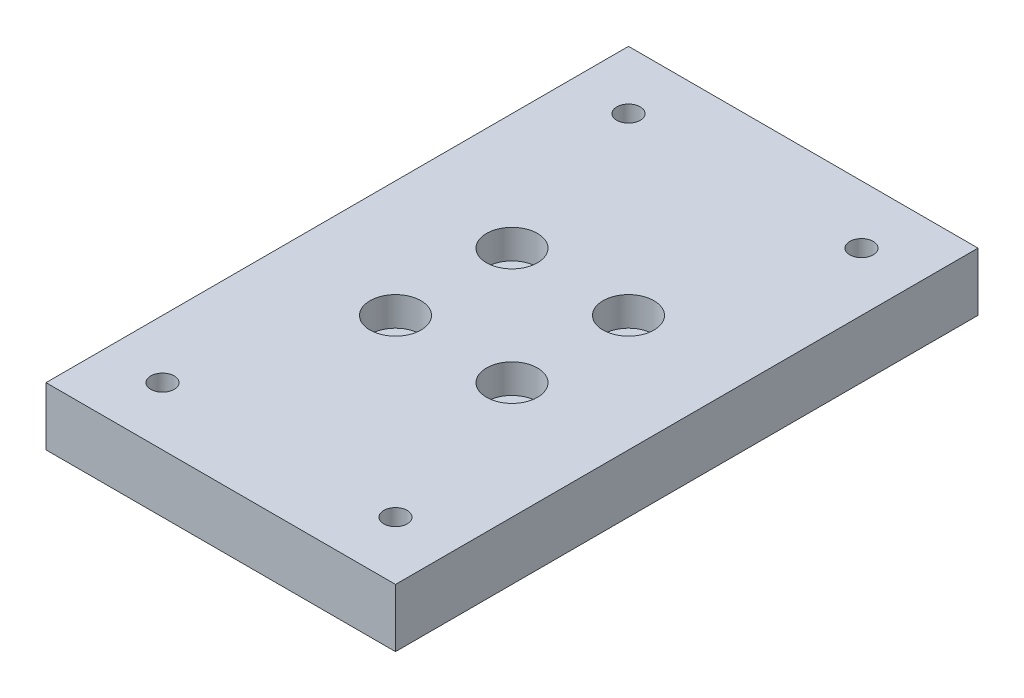
ISO-10303-21;
HEADER;
FILE_DESCRIPTION(('STEP AP214'),'2;1');
FILE_NAME('part.step','',(''),(''),'','','');
FILE_SCHEMA(('AUTOMOTIVE_DESIGN { 1 0 10303 214 1 1 1 1 }'));
ENDSEC;
DATA;
#1=APPLICATION_CONTEXT('core data for automotive mechanical design processes');
#2=APPLICATION_PROTOCOL_DEFINITION('international standard','automotive_design',2000,#1);
#3=PRODUCT_CONTEXT('',#1,'mechanical');
#4=PRODUCT('Part','Part','',(#3));
#5=PRODUCT_RELATED_PRODUCT_CATEGORY('part','',(#4));
#6=PRODUCT_DEFINITION_FORMATION('','',#4);
#7=PRODUCT_DEFINITION_CONTEXT('part definition',#1,'design');
#8=PRODUCT_DEFINITION('design','',#6,#7);
#9=PRODUCT_DEFINITION_SHAPE('','',#8);
#10=(LENGTH_UNIT() NAMED_UNIT(*) SI_UNIT(.MILLI.,.METRE.));
#11=(NAMED_UNIT(*) PLANE_ANGLE_UNIT() SI_UNIT($,.RADIAN.));
#12=(NAMED_UNIT(*) SI_UNIT($,.STERADIAN.) SOLID_ANGLE_UNIT());
#13=UNCERTAINTY_MEASURE_WITH_UNIT(LENGTH_MEASURE(1.E-05),#10,'distance_accuracy_value','');
#14=(GEOMETRIC_REPRESENTATION_CONTEXT(3) GLOBAL_UNCERTAINTY_ASSIGNED_CONTEXT((#13)) GLOBAL_UNIT_ASSIGNED_CONTEXT((#10,
#11,#12)) REPRESENTATION_CONTEXT('',''));
#15=CARTESIAN_POINT('',(0.,0.,0.));
#16=DIRECTION('',(0.,0.,1.));
#17=DIRECTION('',(1.,0.,0.));
#18=AXIS2_PLACEMENT_3D('',#15,#16,#17);
#19=CARTESIAN_POINT('',(0.,12.7,0.));
#20=DIRECTION('',(0.,-1.,0.));
#21=DIRECTION('',(0.,0.,-1.));
#22=AXIS2_PLACEMENT_3D('',#19,#20,#21);
#23=PLANE('',#22);
#24=CARTESIAN_POINT('',(25.4,12.7,-50.8));
#25=DIRECTION('',(0.,1.,0.));
#26=DIRECTION('',(0.,0.,1.));
#27=AXIS2_PLACEMENT_3D('',#24,#25,#26);
#28=CIRCLE('',#27,2.5527);
#29=CARTESIAN_POINT('',(25.4,12.7,-48.2473));
#30=VERTEX_POINT('',#29);
#31=EDGE_CURVE('E274',#30,#30,#28,.T.);
#32=ORIENTED_EDGE('',*,*,#31,.F.);
#33=EDGE_LOOP('',(#32));
#34=FACE_BOUND('',#33,.T.);
#35=CARTESIAN_POINT('',(-25.4,12.7,-50.8));
#36=DIRECTION('',(0.,1.,0.));
#37=DIRECTION('',(0.,0.,1.));
#38=AXIS2_PLACEMENT_3D('',#35,#36,#37);
#39=CIRCLE('',#38,2.5527);
#40=CARTESIAN_POINT('',(-25.4,12.7,-48.2473));
#41=VERTEX_POINT('',#40);
#42=EDGE_CURVE('E276',#41,#41,#39,.T.);
#43=ORIENTED_EDGE('',*,*,#42,.F.);
#44=EDGE_LOOP('',(#43));
#45=FACE_BOUND('',#44,.T.);
#46=CARTESIAN_POINT('',(-25.4,12.7,50.8));
#47=DIRECTION('',(0.,1.,0.));
#48=DIRECTION('',(0.,0.,1.));
#49=AXIS2_PLACEMENT_3D('',#46,#47,#48);
#50=CIRCLE('',#49,2.5527);
#51=CARTESIAN_POINT('',(-25.4,12.7,53.3527));
#52=VERTEX_POINT('',#51);
#53=EDGE_CURVE('E284',#52,#52,#50,.T.);
#54=ORIENTED_EDGE('',*,*,#53,.F.);
#55=EDGE_LOOP('',(#54));
#56=FACE_BOUND('',#55,.T.);
#57=CARTESIAN_POINT('',(25.4,12.7,50.8));
#58=DIRECTION('',(0.,1.,0.));
#59=DIRECTION('',(0.,0.,1.));
#60=AXIS2_PLACEMENT_3D('',#57,#58,#59);
#61=CIRCLE('',#60,2.5527);
#62=CARTESIAN_POINT('',(25.4,12.7,53.3527));
#63=VERTEX_POINT('',#62);
#64=EDGE_CURVE('E290',#63,#63,#61,.T.);
#65=ORIENTED_EDGE('',*,*,#64,.F.);
#66=EDGE_LOOP('',(#65));
#67=FACE_BOUND('',#66,.T.);
#68=CARTESIAN_POINT('',(12.7000000000003,12.7,12.7));
#69=DIRECTION('',(0.,1.,0.));
#70=DIRECTION('',(0.,0.,1.));
#71=AXIS2_PLACEMENT_3D('',#68,#69,#70);
#72=CIRCLE('',#71,5.55625);
#73=CARTESIAN_POINT('',(12.7000000000003,12.7,18.25625));
#74=VERTEX_POINT('',#73);
#75=EDGE_CURVE('E135',#74,#74,#72,.T.);
#76=ORIENTED_EDGE('',*,*,#75,.F.);
#77=EDGE_LOOP('',(#76));
#78=FACE_BOUND('',#77,.T.);
#79=CARTESIAN_POINT('',(-12.6999999999997,12.7,12.7));
#80=DIRECTION('',(0.,1.,0.));
#81=DIRECTION('',(0.,0.,1.));
#82=AXIS2_PLACEMENT_3D('',#79,#80,#81);
#83=CIRCLE('',#82,5.55625);
#84=CARTESIAN_POINT('',(-12.6999999999997,12.7,18.25625));
#85=VERTEX_POINT('',#84);
#86=EDGE_CURVE('E131',#85,#85,#83,.T.);
#87=ORIENTED_EDGE('',*,*,#86,.F.);
#88=EDGE_LOOP('',(#87));
#89=FACE_BOUND('',#88,.T.);
#90=DIRECTION('',(0.,0.,-1.));
#91=VECTOR('',#90,1.);
#92=CARTESIAN_POINT('',(38.1,12.7,63.5));
#93=LINE('',#92,#91);
#94=CARTESIAN_POINT('',(38.1,12.7,63.5));
#95=VERTEX_POINT('',#94);
#96=CARTESIAN_POINT('',(38.1,12.7,-63.5));
#97=VERTEX_POINT('',#96);
#98=EDGE_CURVE('E102',#95,#97,#93,.T.);
#99=ORIENTED_EDGE('',*,*,#98,.T.);
#100=DIRECTION('',(-1.,0.,0.));
#101=VECTOR('',#100,1.);
#102=CARTESIAN_POINT('',(-38.1,12.7,-63.5));
#103=LINE('',#102,#101);
#104=CARTESIAN_POINT('',(-38.1,12.7,-63.5));
#105=VERTEX_POINT('',#104);
#106=EDGE_CURVE('E97',#97,#105,#103,.T.);
#107=ORIENTED_EDGE('',*,*,#106,.T.);
#108=DIRECTION('',(0.,0.,1.));
#109=VECTOR('',#108,1.);
#110=CARTESIAN_POINT('',(-38.1,12.7,63.5));
#111=LINE('',#110,#109);
#112=CARTESIAN_POINT('',(-38.1,12.7,63.5));
#113=VERTEX_POINT('',#112);
#114=EDGE_CURVE('E100',#105,#113,#111,.T.);
#115=ORIENTED_EDGE('',*,*,#114,.T.);
#116=DIRECTION('',(1.,0.,0.));
#117=VECTOR('',#116,1.);
#118=CARTESIAN_POINT('',(-38.1,12.7,63.5));
#119=LINE('',#118,#117);
#120=EDGE_CURVE('E67',#113,#95,#119,.T.);
#121=ORIENTED_EDGE('',*,*,#120,.T.);
#122=EDGE_LOOP('',(#99,#107,#115,#121));
#123=FACE_BOUND('',#122,.T.);
#124=CARTESIAN_POINT('',(12.7,12.7,-12.7));
#125=DIRECTION('',(0.,1.,0.));
#126=DIRECTION('',(0.,0.,1.));
#127=AXIS2_PLACEMENT_3D('',#124,#125,#126);
#128=CIRCLE('',#127,5.55625);
#129=CARTESIAN_POINT('',(12.7,12.7,-7.14375));
#130=VERTEX_POINT('',#129);
#131=EDGE_CURVE('E142',#130,#130,#128,.T.);
#132=ORIENTED_EDGE('',*,*,#131,.F.);
#133=EDGE_LOOP('',(#132));
#134=FACE_BOUND('',#133,.T.);
#135=CARTESIAN_POINT('',(-12.7,12.7,-12.7));
#136=DIRECTION('',(0.,1.,0.));
#137=DIRECTION('',(0.,0.,1.));
#138=AXIS2_PLACEMENT_3D('',#135,#136,#137);
#139=CIRCLE('',#138,5.55625);
#140=CARTESIAN_POINT('',(-12.7,12.7,-7.14375));
#141=VERTEX_POINT('',#140);
#142=EDGE_CURVE('E296',#141,#141,#139,.T.);
#143=ORIENTED_EDGE('',*,*,#142,.F.);
#144=EDGE_LOOP('',(#143));
#145=FACE_BOUND('',#144,.T.);
#146=ADVANCED_FACE('F48',(#34,#45,#56,#67,#78,#89,#123,#134,#145),#23,.F.);
#147=CARTESIAN_POINT('',(0.,0.,0.));
#148=DIRECTION('',(0.,-1.,0.));
#149=DIRECTION('',(0.,0.,-1.));
#150=AXIS2_PLACEMENT_3D('',#147,#148,#149);
#151=PLANE('',#150);
#152=CARTESIAN_POINT('',(25.4,0.,-50.8));
#153=DIRECTION('',(0.,1.,0.));
#154=DIRECTION('',(0.,0.,1.));
#155=AXIS2_PLACEMENT_3D('',#152,#153,#154);
#156=CIRCLE('',#155,2.5527);
#157=CARTESIAN_POINT('',(25.4,0.,-48.2473));
#158=VERTEX_POINT('',#157);
#159=EDGE_CURVE('E272',#158,#158,#156,.T.);
#160=ORIENTED_EDGE('',*,*,#159,.T.);
#161=EDGE_LOOP('',(#160));
#162=FACE_BOUND('',#161,.T.);
#163=CARTESIAN_POINT('',(-25.4,0.,-50.8));
#164=DIRECTION('',(0.,1.,0.));
#165=DIRECTION('',(0.,0.,1.));
#166=AXIS2_PLACEMENT_3D('',#163,#164,#165);
#167=CIRCLE('',#166,2.5527);
#168=CARTESIAN_POINT('',(-25.4,0.,-48.2473));
#169=VERTEX_POINT('',#168);
#170=EDGE_CURVE('E281',#169,#169,#167,.T.);
#171=ORIENTED_EDGE('',*,*,#170,.T.);
#172=EDGE_LOOP('',(#171));
#173=FACE_BOUND('',#172,.T.);
#174=CARTESIAN_POINT('',(-25.4,0.,50.8));
#175=DIRECTION('',(0.,1.,0.));
#176=DIRECTION('',(0.,0.,1.));
#177=AXIS2_PLACEMENT_3D('',#174,#175,#176);
#178=CIRCLE('',#177,2.5527);
#179=CARTESIAN_POINT('',(-25.4,0.,53.3527));
#180=VERTEX_POINT('',#179);
#181=EDGE_CURVE('E287',#180,#180,#178,.T.);
#182=ORIENTED_EDGE('',*,*,#181,.T.);
#183=EDGE_LOOP('',(#182));
#184=FACE_BOUND('',#183,.T.);
#185=CARTESIAN_POINT('',(25.4,0.,50.8));
#186=DIRECTION('',(0.,1.,0.));
#187=DIRECTION('',(0.,0.,1.));
#188=AXIS2_PLACEMENT_3D('',#185,#186,#187);
#189=CIRCLE('',#188,2.5527);
#190=CARTESIAN_POINT('',(25.4,0.,53.3527));
#191=VERTEX_POINT('',#190);
#192=EDGE_CURVE('E293',#191,#191,#189,.T.);
#193=ORIENTED_EDGE('',*,*,#192,.T.);
#194=EDGE_LOOP('',(#193));
#195=FACE_BOUND('',#194,.T.);
#196=CARTESIAN_POINT('',(12.7000000000003,0.,12.7));
#197=DIRECTION('',(0.,1.,0.));
#198=DIRECTION('',(0.,0.,1.));
#199=AXIS2_PLACEMENT_3D('',#196,#197,#198);
#200=CIRCLE('',#199,3.429);
#201=CARTESIAN_POINT('',(12.7000000000003,0.,16.129));
#202=VERTEX_POINT('',#201);
#203=EDGE_CURVE('E158',#202,#202,#200,.T.);
#204=ORIENTED_EDGE('',*,*,#203,.T.);
#205=EDGE_LOOP('',(#204));
#206=FACE_BOUND('',#205,.T.);
#207=CARTESIAN_POINT('',(-12.7,0.,-12.7));
#208=DIRECTION('',(0.,1.,0.));
#209=DIRECTION('',(0.,0.,1.));
#210=AXIS2_PLACEMENT_3D('',#207,#208,#209);
#211=CIRCLE('',#210,3.429);
#212=CARTESIAN_POINT('',(-12.7,0.,-9.271));
#213=VERTEX_POINT('',#212);
#214=EDGE_CURVE('E118',#213,#213,#211,.T.);
#215=ORIENTED_EDGE('',*,*,#214,.T.);
#216=EDGE_LOOP('',(#215));
#217=FACE_BOUND('',#216,.T.);
#218=DIRECTION('',(0.,0.,-1.));
#219=VECTOR('',#218,1.);
#220=CARTESIAN_POINT('',(38.1,0.,63.5));
#221=LINE('',#220,#219);
#222=CARTESIAN_POINT('',(38.1,0.,63.5));
#223=VERTEX_POINT('',#222);
#224=CARTESIAN_POINT('',(38.1,0.,-63.5));
#225=VERTEX_POINT('',#224);
#226=EDGE_CURVE('E115',#223,#225,#221,.T.);
#227=ORIENTED_EDGE('',*,*,#226,.F.);
#228=DIRECTION('',(1.,0.,0.));
#229=VECTOR('',#228,1.);
#230=CARTESIAN_POINT('',(-38.1,0.,63.5));
#231=LINE('',#230,#229);
#232=CARTESIAN_POINT('',(-38.1,0.,63.5));
#233=VERTEX_POINT('',#232);
#234=EDGE_CURVE('E90',#233,#223,#231,.T.);
#235=ORIENTED_EDGE('',*,*,#234,.F.);
#236=DIRECTION('',(0.,0.,1.));
#237=VECTOR('',#236,1.);
#238=CARTESIAN_POINT('',(-38.1,0.,63.5));
#239=LINE('',#238,#237);
#240=CARTESIAN_POINT('',(-38.1,0.,-63.5));
#241=VERTEX_POINT('',#240);
#242=EDGE_CURVE('E84',#241,#233,#239,.T.);
#243=ORIENTED_EDGE('',*,*,#242,.F.);
#244=DIRECTION('',(-1.,0.,0.));
#245=VECTOR('',#244,1.);
#246=CARTESIAN_POINT('',(-38.1,0.,-63.5));
#247=LINE('',#246,#245);
#248=EDGE_CURVE('E106',#225,#241,#247,.T.);
#249=ORIENTED_EDGE('',*,*,#248,.F.);
#250=EDGE_LOOP('',(#227,#235,#243,#249));
#251=FACE_BOUND('',#250,.T.);
#252=CARTESIAN_POINT('',(12.7,0.,-12.7));
#253=DIRECTION('',(0.,1.,0.));
#254=DIRECTION('',(0.,0.,1.));
#255=AXIS2_PLACEMENT_3D('',#252,#253,#254);
#256=CIRCLE('',#255,3.429);
#257=CARTESIAN_POINT('',(12.7,0.,-9.271));
#258=VERTEX_POINT('',#257);
#259=EDGE_CURVE('E161',#258,#258,#256,.T.);
#260=ORIENTED_EDGE('',*,*,#259,.T.);
#261=EDGE_LOOP('',(#260));
#262=FACE_BOUND('',#261,.T.);
#263=CARTESIAN_POINT('',(-12.6999999999997,0.,12.7));
#264=DIRECTION('',(0.,1.,0.));
#265=DIRECTION('',(0.,0.,1.));
#266=AXIS2_PLACEMENT_3D('',#263,#264,#265);
#267=CIRCLE('',#266,3.429);
#268=CARTESIAN_POINT('',(-12.6999999999997,0.,16.129));
#269=VERTEX_POINT('',#268);
#270=EDGE_CURVE('E127',#269,#269,#267,.T.);
#271=ORIENTED_EDGE('',*,*,#270,.T.);
#272=EDGE_LOOP('',(#271));
#273=FACE_BOUND('',#272,.T.);
#274=ADVANCED_FACE('F167',(#162,#173,#184,#195,#206,#217,#251,#262,#273),#151,.T.);
#275=CARTESIAN_POINT('',(38.1,12.7,63.5));
#276=DIRECTION('',(-1.,0.,0.));
#277=DIRECTION('',(0.,0.,1.));
#278=AXIS2_PLACEMENT_3D('',#275,#276,#277);
#279=PLANE('',#278);
#280=ORIENTED_EDGE('',*,*,#226,.T.);
#281=DIRECTION('',(0.,-1.,0.));
#282=VECTOR('',#281,1.);
#283=CARTESIAN_POINT('',(38.1,12.7,-63.5));
#284=LINE('',#283,#282);
#285=EDGE_CURVE('E13',#97,#225,#284,.T.);
#286=ORIENTED_EDGE('',*,*,#285,.F.);
#287=ORIENTED_EDGE('',*,*,#98,.F.);
#288=DIRECTION('',(0.,-1.,0.));
#289=VECTOR('',#288,1.);
#290=CARTESIAN_POINT('',(38.1,12.7,63.5));
#291=LINE('',#290,#289);
#292=EDGE_CURVE('E111',#95,#223,#291,.T.);
#293=ORIENTED_EDGE('',*,*,#292,.T.);
#294=EDGE_LOOP('',(#280,#286,#287,#293));
#295=FACE_BOUND('',#294,.T.);
#296=ADVANCED_FACE('F50',(#295),#279,.F.);
#297=CARTESIAN_POINT('',(-38.1,12.7,-63.5));
#298=DIRECTION('',(0.,0.,1.));
#299=DIRECTION('',(1.,0.,0.));
#300=AXIS2_PLACEMENT_3D('',#297,#298,#299);
#301=PLANE('',#300);
#302=ORIENTED_EDGE('',*,*,#248,.T.);
#303=DIRECTION('',(0.,-1.,0.));
#304=VECTOR('',#303,1.);
#305=CARTESIAN_POINT('',(-38.1,12.7,-63.5));
#306=LINE('',#305,#304);
#307=EDGE_CURVE('E58',#105,#241,#306,.T.);
#308=ORIENTED_EDGE('',*,*,#307,.F.);
#309=ORIENTED_EDGE('',*,*,#106,.F.);
#310=ORIENTED_EDGE('',*,*,#285,.T.);
#311=EDGE_LOOP('',(#302,#308,#309,#310));
#312=FACE_BOUND('',#311,.T.);
#313=ADVANCED_FACE('F105',(#312),#301,.F.);
#314=CARTESIAN_POINT('',(-38.1,12.7,63.5));
#315=DIRECTION('',(1.,0.,0.));
#316=DIRECTION('',(0.,0.,-1.));
#317=AXIS2_PLACEMENT_3D('',#314,#315,#316);
#318=PLANE('',#317);
#319=ORIENTED_EDGE('',*,*,#242,.T.);
#320=DIRECTION('',(0.,-1.,0.));
#321=VECTOR('',#320,1.);
#322=CARTESIAN_POINT('',(-38.1,12.7,63.5));
#323=LINE('',#322,#321);
#324=EDGE_CURVE('E107',#113,#233,#323,.T.);
#325=ORIENTED_EDGE('',*,*,#324,.F.);
#326=ORIENTED_EDGE('',*,*,#114,.F.);
#327=ORIENTED_EDGE('',*,*,#307,.T.);
#328=EDGE_LOOP('',(#319,#325,#326,#327));
#329=FACE_BOUND('',#328,.T.);
#330=ADVANCED_FACE('F109',(#329),#318,.F.);
#331=CARTESIAN_POINT('',(-38.1,12.7,63.5));
#332=DIRECTION('',(0.,0.,-1.));
#333=DIRECTION('',(-1.,0.,0.));
#334=AXIS2_PLACEMENT_3D('',#331,#332,#333);
#335=PLANE('',#334);
#336=ORIENTED_EDGE('',*,*,#234,.T.);
#337=ORIENTED_EDGE('',*,*,#292,.F.);
#338=ORIENTED_EDGE('',*,*,#120,.F.);
#339=ORIENTED_EDGE('',*,*,#324,.T.);
#340=EDGE_LOOP('',(#336,#337,#338,#339));
#341=FACE_BOUND('',#340,.T.);
#342=ADVANCED_FACE('F173',(#341),#335,.F.);
#343=CARTESIAN_POINT('',(-12.7,12.7,-12.7));
#344=DIRECTION('',(0.,-1.,0.));
#345=DIRECTION('',(0.,0.,-1.));
#346=AXIS2_PLACEMENT_3D('',#343,#344,#345);
#347=CYLINDRICAL_SURFACE('',#346,3.429);
#348=CARTESIAN_POINT('',(-12.7,6.35,-12.7));
#349=DIRECTION('',(0.,-1.,0.));
#350=DIRECTION('',(0.,0.,-1.));
#351=AXIS2_PLACEMENT_3D('',#348,#349,#350);
#352=CIRCLE('',#351,3.429);
#353=CARTESIAN_POINT('',(-12.7,6.35,-16.129));
#354=VERTEX_POINT('',#353);
#355=EDGE_CURVE('E52',#354,#354,#352,.T.);
#356=ORIENTED_EDGE('',*,*,#355,.F.);
#357=EDGE_LOOP('',(#356));
#358=FACE_BOUND('',#357,.T.);
#359=ORIENTED_EDGE('',*,*,#214,.F.);
#360=EDGE_LOOP('',(#359));
#361=FACE_BOUND('',#360,.T.);
#362=ADVANCED_FACE('F170',(#358,#361),#347,.F.);
#363=CARTESIAN_POINT('',(12.7,12.7,-12.7));
#364=DIRECTION('',(0.,-1.,0.));
#365=DIRECTION('',(0.,0.,-1.));
#366=AXIS2_PLACEMENT_3D('',#363,#364,#365);
#367=CYLINDRICAL_SURFACE('',#366,3.429);
#368=CARTESIAN_POINT('',(12.7,6.35,-12.7));
#369=DIRECTION('',(0.,-1.,0.));
#370=DIRECTION('',(0.,0.,-1.));
#371=AXIS2_PLACEMENT_3D('',#368,#369,#370);
#372=CIRCLE('',#371,3.429);
#373=CARTESIAN_POINT('',(12.7,6.35,-16.129));
#374=VERTEX_POINT('',#373);
#375=EDGE_CURVE('E133',#374,#374,#372,.T.);
#376=ORIENTED_EDGE('',*,*,#375,.F.);
#377=EDGE_LOOP('',(#376));
#378=FACE_BOUND('',#377,.T.);
#379=ORIENTED_EDGE('',*,*,#259,.F.);
#380=EDGE_LOOP('',(#379));
#381=FACE_BOUND('',#380,.T.);
#382=ADVANCED_FACE('F172',(#378,#381),#367,.F.);
#383=CARTESIAN_POINT('',(12.7000000000003,12.7,12.7));
#384=DIRECTION('',(0.,-1.,0.));
#385=DIRECTION('',(0.,0.,-1.));
#386=AXIS2_PLACEMENT_3D('',#383,#384,#385);
#387=CYLINDRICAL_SURFACE('',#386,3.429);
#388=CARTESIAN_POINT('',(12.7000000000003,6.35,12.7));
#389=DIRECTION('',(0.,-1.,0.));
#390=DIRECTION('',(0.,0.,-1.));
#391=AXIS2_PLACEMENT_3D('',#388,#389,#390);
#392=CIRCLE('',#391,3.429);
#393=CARTESIAN_POINT('',(12.7000000000003,6.35,9.27099999999999));
#394=VERTEX_POINT('',#393);
#395=EDGE_CURVE('E129',#394,#394,#392,.T.);
#396=ORIENTED_EDGE('',*,*,#395,.F.);
#397=EDGE_LOOP('',(#396));
#398=FACE_BOUND('',#397,.T.);
#399=ORIENTED_EDGE('',*,*,#203,.F.);
#400=EDGE_LOOP('',(#399));
#401=FACE_BOUND('',#400,.T.);
#402=ADVANCED_FACE('F180',(#398,#401),#387,.F.);
#403=CARTESIAN_POINT('',(-12.6999999999997,12.7,12.7));
#404=DIRECTION('',(0.,-1.,0.));
#405=DIRECTION('',(0.,0.,-1.));
#406=AXIS2_PLACEMENT_3D('',#403,#404,#405);
#407=CYLINDRICAL_SURFACE('',#406,3.429);
#408=CARTESIAN_POINT('',(-12.6999999999997,6.35,12.7));
#409=DIRECTION('',(0.,-1.,0.));
#410=DIRECTION('',(0.,0.,-1.));
#411=AXIS2_PLACEMENT_3D('',#408,#409,#410);
#412=CIRCLE('',#411,3.429);
#413=CARTESIAN_POINT('',(-12.6999999999997,6.35,9.27099999999999));
#414=VERTEX_POINT('',#413);
#415=EDGE_CURVE('E124',#414,#414,#412,.T.);
#416=ORIENTED_EDGE('',*,*,#415,.F.);
#417=EDGE_LOOP('',(#416));
#418=FACE_BOUND('',#417,.T.);
#419=ORIENTED_EDGE('',*,*,#270,.F.);
#420=EDGE_LOOP('',(#419));
#421=FACE_BOUND('',#420,.T.);
#422=ADVANCED_FACE('F210',(#418,#421),#407,.F.);
#423=CARTESIAN_POINT('',(-9.32179999999973,6.35,12.7));
#424=DIRECTION('',(0.,-1.,0.));
#425=DIRECTION('',(0.,0.,-1.));
#426=AXIS2_PLACEMENT_3D('',#423,#424,#425);
#427=PLANE('',#426);
#428=ORIENTED_EDGE('',*,*,#415,.T.);
#429=EDGE_LOOP('',(#428));
#430=FACE_BOUND('',#429,.T.);
#431=CARTESIAN_POINT('',(-12.6999999999997,6.35,12.7));
#432=DIRECTION('',(0.,1.,0.));
#433=DIRECTION('',(0.,0.,1.));
#434=AXIS2_PLACEMENT_3D('',#431,#432,#433);
#435=CIRCLE('',#434,5.55625);
#436=CARTESIAN_POINT('',(-12.6999999999997,6.35,18.25625));
#437=VERTEX_POINT('',#436);
#438=EDGE_CURVE('E128',#437,#437,#435,.T.);
#439=ORIENTED_EDGE('',*,*,#438,.T.);
#440=EDGE_LOOP('',(#439));
#441=FACE_BOUND('',#440,.T.);
#442=ADVANCED_FACE('F212',(#430,#441),#427,.F.);
#443=CARTESIAN_POINT('',(-12.6999999999997,12.7,12.7));
#444=DIRECTION('',(0.,1.,0.));
#445=DIRECTION('',(0.,0.,1.));
#446=AXIS2_PLACEMENT_3D('',#443,#444,#445);
#447=CYLINDRICAL_SURFACE('',#446,5.55625);
#448=ORIENTED_EDGE('',*,*,#438,.F.);
#449=EDGE_LOOP('',(#448));
#450=FACE_BOUND('',#449,.T.);
#451=ORIENTED_EDGE('',*,*,#86,.T.);
#452=EDGE_LOOP('',(#451));
#453=FACE_BOUND('',#452,.T.);
#454=ADVANCED_FACE('F219',(#450,#453),#447,.F.);
#455=CARTESIAN_POINT('',(16.0782000000003,6.35,12.7));
#456=DIRECTION('',(0.,-1.,0.));
#457=DIRECTION('',(0.,0.,-1.));
#458=AXIS2_PLACEMENT_3D('',#455,#456,#457);
#459=PLANE('',#458);
#460=ORIENTED_EDGE('',*,*,#395,.T.);
#461=EDGE_LOOP('',(#460));
#462=FACE_BOUND('',#461,.T.);
#463=CARTESIAN_POINT('',(12.7000000000003,6.35,12.7));
#464=DIRECTION('',(0.,1.,0.));
#465=DIRECTION('',(0.,0.,1.));
#466=AXIS2_PLACEMENT_3D('',#463,#464,#465);
#467=CIRCLE('',#466,5.55625);
#468=CARTESIAN_POINT('',(12.7000000000003,6.35,18.25625));
#469=VERTEX_POINT('',#468);
#470=EDGE_CURVE('E132',#469,#469,#467,.T.);
#471=ORIENTED_EDGE('',*,*,#470,.T.);
#472=EDGE_LOOP('',(#471));
#473=FACE_BOUND('',#472,.T.);
#474=ADVANCED_FACE('F228',(#462,#473),#459,.F.);
#475=CARTESIAN_POINT('',(12.7000000000003,12.7,12.7));
#476=DIRECTION('',(0.,1.,0.));
#477=DIRECTION('',(0.,0.,1.));
#478=AXIS2_PLACEMENT_3D('',#475,#476,#477);
#479=CYLINDRICAL_SURFACE('',#478,5.55625);
#480=ORIENTED_EDGE('',*,*,#470,.F.);
#481=EDGE_LOOP('',(#480));
#482=FACE_BOUND('',#481,.T.);
#483=ORIENTED_EDGE('',*,*,#75,.T.);
#484=EDGE_LOOP('',(#483));
#485=FACE_BOUND('',#484,.T.);
#486=ADVANCED_FACE('F232',(#482,#485),#479,.F.);
#487=CARTESIAN_POINT('',(16.0782,6.35,-12.7));
#488=DIRECTION('',(0.,-1.,0.));
#489=DIRECTION('',(0.,0.,-1.));
#490=AXIS2_PLACEMENT_3D('',#487,#488,#489);
#491=PLANE('',#490);
#492=ORIENTED_EDGE('',*,*,#375,.T.);
#493=EDGE_LOOP('',(#492));
#494=FACE_BOUND('',#493,.T.);
#495=CARTESIAN_POINT('',(12.7,6.35,-12.7));
#496=DIRECTION('',(0.,1.,0.));
#497=DIRECTION('',(0.,0.,1.));
#498=AXIS2_PLACEMENT_3D('',#495,#496,#497);
#499=CIRCLE('',#498,5.55625);
#500=CARTESIAN_POINT('',(12.7,6.35,-7.14375));
#501=VERTEX_POINT('',#500);
#502=EDGE_CURVE('E136',#501,#501,#499,.T.);
#503=ORIENTED_EDGE('',*,*,#502,.T.);
#504=EDGE_LOOP('',(#503));
#505=FACE_BOUND('',#504,.T.);
#506=ADVANCED_FACE('F236',(#494,#505),#491,.F.);
#507=CARTESIAN_POINT('',(12.7,12.7,-12.7));
#508=DIRECTION('',(0.,1.,0.));
#509=DIRECTION('',(0.,0.,1.));
#510=AXIS2_PLACEMENT_3D('',#507,#508,#509);
#511=CYLINDRICAL_SURFACE('',#510,5.55625);
#512=ORIENTED_EDGE('',*,*,#502,.F.);
#513=EDGE_LOOP('',(#512));
#514=FACE_BOUND('',#513,.T.);
#515=ORIENTED_EDGE('',*,*,#131,.T.);
#516=EDGE_LOOP('',(#515));
#517=FACE_BOUND('',#516,.T.);
#518=ADVANCED_FACE('F240',(#514,#517),#511,.F.);
#519=CARTESIAN_POINT('',(-9.3218,6.35,-12.7));
#520=DIRECTION('',(0.,-1.,0.));
#521=DIRECTION('',(0.,0.,-1.));
#522=AXIS2_PLACEMENT_3D('',#519,#520,#521);
#523=PLANE('',#522);
#524=ORIENTED_EDGE('',*,*,#355,.T.);
#525=EDGE_LOOP('',(#524));
#526=FACE_BOUND('',#525,.T.);
#527=CARTESIAN_POINT('',(-12.7,6.35,-12.7));
#528=DIRECTION('',(0.,1.,0.));
#529=DIRECTION('',(0.,0.,1.));
#530=AXIS2_PLACEMENT_3D('',#527,#528,#529);
#531=CIRCLE('',#530,5.55625);
#532=CARTESIAN_POINT('',(-12.7,6.35,-7.14375));
#533=VERTEX_POINT('',#532);
#534=EDGE_CURVE('E298',#533,#533,#531,.T.);
#535=ORIENTED_EDGE('',*,*,#534,.T.);
#536=EDGE_LOOP('',(#535));
#537=FACE_BOUND('',#536,.T.);
#538=ADVANCED_FACE('F243',(#526,#537),#523,.F.);
#539=CARTESIAN_POINT('',(-12.7,12.7,-12.7));
#540=DIRECTION('',(0.,1.,0.));
#541=DIRECTION('',(0.,0.,1.));
#542=AXIS2_PLACEMENT_3D('',#539,#540,#541);
#543=CYLINDRICAL_SURFACE('',#542,5.55625);
#544=ORIENTED_EDGE('',*,*,#534,.F.);
#545=EDGE_LOOP('',(#544));
#546=FACE_BOUND('',#545,.T.);
#547=ORIENTED_EDGE('',*,*,#142,.T.);
#548=EDGE_LOOP('',(#547));
#549=FACE_BOUND('',#548,.T.);
#550=ADVANCED_FACE('F247',(#546,#549),#543,.F.);
#551=CARTESIAN_POINT('',(25.4,12.7,50.8));
#552=DIRECTION('',(0.,1.,0.));
#553=DIRECTION('',(0.,0.,1.));
#554=AXIS2_PLACEMENT_3D('',#551,#552,#553);
#555=CYLINDRICAL_SURFACE('',#554,2.5527);
#556=ORIENTED_EDGE('',*,*,#192,.F.);
#557=EDGE_LOOP('',(#556));
#558=FACE_BOUND('',#557,.T.);
#559=ORIENTED_EDGE('',*,*,#64,.T.);
#560=EDGE_LOOP('',(#559));
#561=FACE_BOUND('',#560,.T.);
#562=ADVANCED_FACE('F251',(#558,#561),#555,.F.);
#563=CARTESIAN_POINT('',(-25.4,12.7,50.8));
#564=DIRECTION('',(0.,1.,0.));
#565=DIRECTION('',(0.,0.,1.));
#566=AXIS2_PLACEMENT_3D('',#563,#564,#565);
#567=CYLINDRICAL_SURFACE('',#566,2.5527);
#568=ORIENTED_EDGE('',*,*,#181,.F.);
#569=EDGE_LOOP('',(#568));
#570=FACE_BOUND('',#569,.T.);
#571=ORIENTED_EDGE('',*,*,#53,.T.);
#572=EDGE_LOOP('',(#571));
#573=FACE_BOUND('',#572,.T.);
#574=ADVANCED_FACE('F255',(#570,#573),#567,.F.);
#575=CARTESIAN_POINT('',(-25.4,12.7,-50.8));
#576=DIRECTION('',(0.,1.,0.));
#577=DIRECTION('',(0.,0.,1.));
#578=AXIS2_PLACEMENT_3D('',#575,#576,#577);
#579=CYLINDRICAL_SURFACE('',#578,2.5527);
#580=ORIENTED_EDGE('',*,*,#170,.F.);
#581=EDGE_LOOP('',(#580));
#582=FACE_BOUND('',#581,.T.);
#583=ORIENTED_EDGE('',*,*,#42,.T.);
#584=EDGE_LOOP('',(#583));
#585=FACE_BOUND('',#584,.T.);
#586=ADVANCED_FACE('F259',(#582,#585),#579,.F.);
#587=CARTESIAN_POINT('',(25.4,12.7,-50.8));
#588=DIRECTION('',(0.,1.,0.));
#589=DIRECTION('',(0.,0.,1.));
#590=AXIS2_PLACEMENT_3D('',#587,#588,#589);
#591=CYLINDRICAL_SURFACE('',#590,2.5527);
#592=ORIENTED_EDGE('',*,*,#159,.F.);
#593=EDGE_LOOP('',(#592));
#594=FACE_BOUND('',#593,.T.);
#595=ORIENTED_EDGE('',*,*,#31,.T.);
#596=EDGE_LOOP('',(#595));
#597=FACE_BOUND('',#596,.T.);
#598=ADVANCED_FACE('F263',(#594,#597),#591,.F.);
#599=CLOSED_SHELL('',(#146,#274,#296,#313,#330,#342,#362,#382,#402,#422,#442,#454,#474,#486,
#506,#518,#538,#550,#562,#574,#586,#598));
#600=MANIFOLD_SOLID_BREP('B2',#599);
#601=ADVANCED_BREP_SHAPE_REPRESENTATION('',(#18,#600),#14);
#602=SHAPE_DEFINITION_REPRESENTATION(#9,#601);
ENDSEC;
END-ISO-10303-21;
